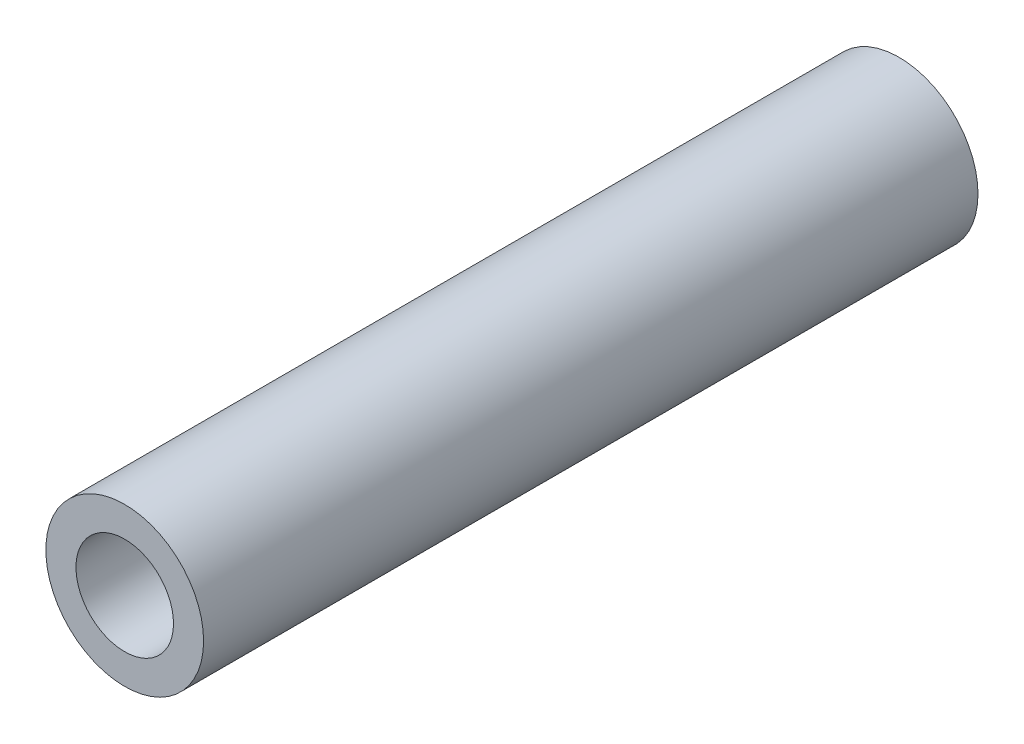
ISO-10303-21;
HEADER;
FILE_DESCRIPTION(('STEP AP214'),'2;1');
FILE_NAME('part.step','',(''),(''),'','','');
FILE_SCHEMA(('AUTOMOTIVE_DESIGN { 1 0 10303 214 1 1 1 1 }'));
ENDSEC;
DATA;
#1=APPLICATION_CONTEXT('core data for automotive mechanical design processes');
#2=APPLICATION_PROTOCOL_DEFINITION('international standard','automotive_design',2000,#1);
#3=PRODUCT_CONTEXT('',#1,'mechanical');
#4=PRODUCT('Part','Part','',(#3));
#5=PRODUCT_RELATED_PRODUCT_CATEGORY('part','',(#4));
#6=PRODUCT_DEFINITION_FORMATION('','',#4);
#7=PRODUCT_DEFINITION_CONTEXT('part definition',#1,'design');
#8=PRODUCT_DEFINITION('design','',#6,#7);
#9=PRODUCT_DEFINITION_SHAPE('','',#8);
#10=(LENGTH_UNIT() NAMED_UNIT(*) SI_UNIT(.MILLI.,.METRE.));
#11=(NAMED_UNIT(*) PLANE_ANGLE_UNIT() SI_UNIT($,.RADIAN.));
#12=(NAMED_UNIT(*) SI_UNIT($,.STERADIAN.) SOLID_ANGLE_UNIT());
#13=UNCERTAINTY_MEASURE_WITH_UNIT(LENGTH_MEASURE(1.E-05),#10,'distance_accuracy_value','');
#14=(GEOMETRIC_REPRESENTATION_CONTEXT(3) GLOBAL_UNCERTAINTY_ASSIGNED_CONTEXT((#13)) GLOBAL_UNIT_ASSIGNED_CONTEXT((#10,
#11,#12)) REPRESENTATION_CONTEXT('',''));
#15=CARTESIAN_POINT('',(0.,0.,0.));
#16=DIRECTION('',(0.,0.,1.));
#17=DIRECTION('',(1.,0.,0.));
#18=AXIS2_PLACEMENT_3D('',#15,#16,#17);
#19=CARTESIAN_POINT('',(0.,0.,27.));
#20=DIRECTION('',(0.,0.,1.));
#21=DIRECTION('',(1.,0.,0.));
#22=AXIS2_PLACEMENT_3D('',#19,#20,#21);
#23=PLANE('',#22);
#24=CARTESIAN_POINT('',(0.,0.,27.));
#25=DIRECTION('',(0.,0.,1.));
#26=DIRECTION('',(1.,0.,0.));
#27=AXIS2_PLACEMENT_3D('',#24,#25,#26);
#28=CIRCLE('',#27,2.75);
#29=CARTESIAN_POINT('',(2.75,0.,27.));
#30=VERTEX_POINT('',#29);
#31=EDGE_CURVE('E10',#30,#30,#28,.T.);
#32=ORIENTED_EDGE('',*,*,#31,.T.);
#33=EDGE_LOOP('',(#32));
#34=FACE_BOUND('',#33,.T.);
#35=CARTESIAN_POINT('',(0.,0.,27.));
#36=DIRECTION('',(0.,0.,1.));
#37=DIRECTION('',(1.,0.,0.));
#38=AXIS2_PLACEMENT_3D('',#35,#36,#37);
#39=CIRCLE('',#38,1.7);
#40=CARTESIAN_POINT('',(1.7,0.,27.));
#41=VERTEX_POINT('',#40);
#42=EDGE_CURVE('E56',#41,#41,#39,.T.);
#43=ORIENTED_EDGE('',*,*,#42,.F.);
#44=EDGE_LOOP('',(#43));
#45=FACE_BOUND('',#44,.T.);
#46=ADVANCED_FACE('F43',(#34,#45),#23,.T.);
#47=CARTESIAN_POINT('',(0.,0.,0.));
#48=DIRECTION('',(0.,0.,1.));
#49=DIRECTION('',(1.,0.,0.));
#50=AXIS2_PLACEMENT_3D('',#47,#48,#49);
#51=PLANE('',#50);
#52=CARTESIAN_POINT('',(0.,0.,0.));
#53=DIRECTION('',(0.,0.,1.));
#54=DIRECTION('',(1.,0.,0.));
#55=AXIS2_PLACEMENT_3D('',#52,#53,#54);
#56=CIRCLE('',#55,2.75);
#57=CARTESIAN_POINT('',(2.75,0.,0.));
#58=VERTEX_POINT('',#57);
#59=EDGE_CURVE('E47',#58,#58,#56,.T.);
#60=ORIENTED_EDGE('',*,*,#59,.F.);
#61=EDGE_LOOP('',(#60));
#62=FACE_BOUND('',#61,.T.);
#63=CARTESIAN_POINT('',(0.,0.,0.));
#64=DIRECTION('',(0.,0.,1.));
#65=DIRECTION('',(1.,0.,0.));
#66=AXIS2_PLACEMENT_3D('',#63,#64,#65);
#67=CIRCLE('',#66,1.7);
#68=CARTESIAN_POINT('',(1.7,0.,0.));
#69=VERTEX_POINT('',#68);
#70=EDGE_CURVE('E58',#69,#69,#67,.T.);
#71=ORIENTED_EDGE('',*,*,#70,.T.);
#72=EDGE_LOOP('',(#71));
#73=FACE_BOUND('',#72,.T.);
#74=ADVANCED_FACE('F70',(#62,#73),#51,.F.);
#75=CARTESIAN_POINT('',(0.,0.,27.));
#76=DIRECTION('',(0.,0.,-1.));
#77=DIRECTION('',(-1.,0.,0.));
#78=AXIS2_PLACEMENT_3D('',#75,#76,#77);
#79=CYLINDRICAL_SURFACE('',#78,2.75);
#80=ORIENTED_EDGE('',*,*,#31,.F.);
#81=EDGE_LOOP('',(#80));
#82=FACE_BOUND('',#81,.T.);
#83=ORIENTED_EDGE('',*,*,#59,.T.);
#84=EDGE_LOOP('',(#83));
#85=FACE_BOUND('',#84,.T.);
#86=ADVANCED_FACE('F45',(#82,#85),#79,.T.);
#87=CARTESIAN_POINT('',(0.,0.,27.));
#88=DIRECTION('',(0.,0.,-1.));
#89=DIRECTION('',(-1.,0.,0.));
#90=AXIS2_PLACEMENT_3D('',#87,#88,#89);
#91=CYLINDRICAL_SURFACE('',#90,1.7);
#92=ORIENTED_EDGE('',*,*,#42,.T.);
#93=EDGE_LOOP('',(#92));
#94=FACE_BOUND('',#93,.T.);
#95=ORIENTED_EDGE('',*,*,#70,.F.);
#96=EDGE_LOOP('',(#95));
#97=FACE_BOUND('',#96,.T.);
#98=ADVANCED_FACE('F66',(#94,#97),#91,.F.);
#99=CLOSED_SHELL('',(#46,#74,#86,#98));
#100=MANIFOLD_SOLID_BREP('B2',#99);
#101=ADVANCED_BREP_SHAPE_REPRESENTATION('',(#18,#100),#14);
#102=SHAPE_DEFINITION_REPRESENTATION(#9,#101);
ENDSEC;
END-ISO-10303-21;
